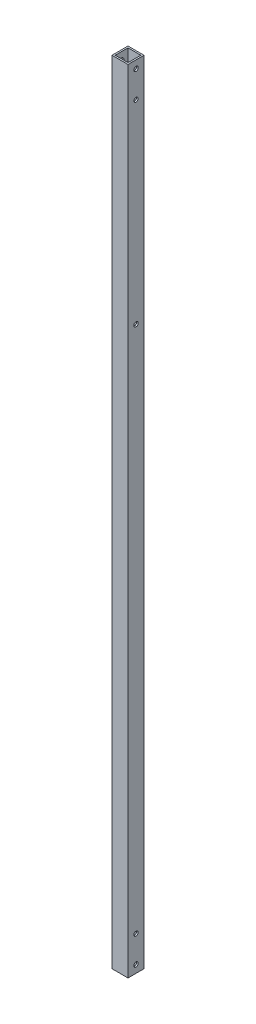
ISO-10303-21;
HEADER;
FILE_DESCRIPTION(('STEP AP214'),'2;1');
FILE_NAME('part.step','',(''),(''),'','','');
FILE_SCHEMA(('AUTOMOTIVE_DESIGN { 1 0 10303 214 1 1 1 1 }'));
ENDSEC;
DATA;
#1=APPLICATION_CONTEXT('core data for automotive mechanical design processes');
#2=APPLICATION_PROTOCOL_DEFINITION('international standard','automotive_design',2000,#1);
#3=PRODUCT_CONTEXT('',#1,'mechanical');
#4=PRODUCT('Part','Part','',(#3));
#5=PRODUCT_RELATED_PRODUCT_CATEGORY('part','',(#4));
#6=PRODUCT_DEFINITION_FORMATION('','',#4);
#7=PRODUCT_DEFINITION_CONTEXT('part definition',#1,'design');
#8=PRODUCT_DEFINITION('design','',#6,#7);
#9=PRODUCT_DEFINITION_SHAPE('','',#8);
#10=(LENGTH_UNIT() NAMED_UNIT(*) SI_UNIT(.MILLI.,.METRE.));
#11=(NAMED_UNIT(*) PLANE_ANGLE_UNIT() SI_UNIT($,.RADIAN.));
#12=(NAMED_UNIT(*) SI_UNIT($,.STERADIAN.) SOLID_ANGLE_UNIT());
#13=UNCERTAINTY_MEASURE_WITH_UNIT(LENGTH_MEASURE(1.E-05),#10,'distance_accuracy_value','');
#14=(GEOMETRIC_REPRESENTATION_CONTEXT(3) GLOBAL_UNCERTAINTY_ASSIGNED_CONTEXT((#13)) GLOBAL_UNIT_ASSIGNED_CONTEXT((#10,
#11,#12)) REPRESENTATION_CONTEXT('',''));
#15=CARTESIAN_POINT('',(0.,0.,0.));
#16=DIRECTION('',(0.,0.,1.));
#17=DIRECTION('',(1.,0.,0.));
#18=AXIS2_PLACEMENT_3D('',#15,#16,#17);
#19=CARTESIAN_POINT('',(0.,741.,0.));
#20=DIRECTION('',(0.,1.,0.));
#21=DIRECTION('',(0.,0.,1.));
#22=AXIS2_PLACEMENT_3D('',#19,#20,#21);
#23=PLANE('',#22);
#24=DIRECTION('',(0.,0.,-1.));
#25=VECTOR('',#24,1.);
#26=CARTESIAN_POINT('',(7.5,741.,7.5));
#27=LINE('',#26,#25);
#28=CARTESIAN_POINT('',(7.5,741.,7.5));
#29=VERTEX_POINT('',#28);
#30=CARTESIAN_POINT('',(7.5,741.,-7.5));
#31=VERTEX_POINT('',#30);
#32=EDGE_CURVE('E162',#29,#31,#27,.T.);
#33=ORIENTED_EDGE('',*,*,#32,.T.);
#34=DIRECTION('',(-1.,0.,0.));
#35=VECTOR('',#34,1.);
#36=CARTESIAN_POINT('',(-7.5,741.,-7.5));
#37=LINE('',#36,#35);
#38=CARTESIAN_POINT('',(-7.5,741.,-7.5));
#39=VERTEX_POINT('',#38);
#40=EDGE_CURVE('E165',#31,#39,#37,.T.);
#41=ORIENTED_EDGE('',*,*,#40,.T.);
#42=DIRECTION('',(0.,0.,1.));
#43=VECTOR('',#42,1.);
#44=CARTESIAN_POINT('',(-7.5,741.,7.5));
#45=LINE('',#44,#43);
#46=CARTESIAN_POINT('',(-7.5,741.,7.5));
#47=VERTEX_POINT('',#46);
#48=EDGE_CURVE('E168',#39,#47,#45,.T.);
#49=ORIENTED_EDGE('',*,*,#48,.T.);
#50=DIRECTION('',(1.,0.,0.));
#51=VECTOR('',#50,1.);
#52=CARTESIAN_POINT('',(-7.5,741.,7.5));
#53=LINE('',#52,#51);
#54=EDGE_CURVE('E170',#47,#29,#53,.T.);
#55=ORIENTED_EDGE('',*,*,#54,.T.);
#56=EDGE_LOOP('',(#33,#41,#49,#55));
#57=FACE_BOUND('',#56,.T.);
#58=DIRECTION('',(-1.,0.,0.));
#59=VECTOR('',#58,1.);
#60=CARTESIAN_POINT('',(0.,741.,-6.));
#61=LINE('',#60,#59);
#62=CARTESIAN_POINT('',(6.,741.,-6.));
#63=VERTEX_POINT('',#62);
#64=CARTESIAN_POINT('',(-6.,741.,-6.));
#65=VERTEX_POINT('',#64);
#66=EDGE_CURVE('E132',#63,#65,#61,.T.);
#67=ORIENTED_EDGE('',*,*,#66,.F.);
#68=DIRECTION('',(0.,0.,-1.));
#69=VECTOR('',#68,1.);
#70=CARTESIAN_POINT('',(6.,741.,0.));
#71=LINE('',#70,#69);
#72=CARTESIAN_POINT('',(6.,741.,6.));
#73=VERTEX_POINT('',#72);
#74=EDGE_CURVE('E124',#73,#63,#71,.T.);
#75=ORIENTED_EDGE('',*,*,#74,.F.);
#76=DIRECTION('',(1.,0.,0.));
#77=VECTOR('',#76,1.);
#78=CARTESIAN_POINT('',(0.,741.,6.));
#79=LINE('',#78,#77);
#80=CARTESIAN_POINT('',(-6.,741.,6.));
#81=VERTEX_POINT('',#80);
#82=EDGE_CURVE('E146',#81,#73,#79,.T.);
#83=ORIENTED_EDGE('',*,*,#82,.F.);
#84=DIRECTION('',(0.,0.,1.));
#85=VECTOR('',#84,1.);
#86=CARTESIAN_POINT('',(-6.,741.,0.));
#87=LINE('',#86,#85);
#88=EDGE_CURVE('E144',#65,#81,#87,.T.);
#89=ORIENTED_EDGE('',*,*,#88,.F.);
#90=EDGE_LOOP('',(#67,#75,#83,#89));
#91=FACE_BOUND('',#90,.T.);
#92=ADVANCED_FACE('F57',(#57,#91),#23,.T.);
#93=CARTESIAN_POINT('',(0.,0.,0.));
#94=DIRECTION('',(0.,1.,0.));
#95=DIRECTION('',(0.,0.,1.));
#96=AXIS2_PLACEMENT_3D('',#93,#94,#95);
#97=PLANE('',#96);
#98=DIRECTION('',(0.,0.,-1.));
#99=VECTOR('',#98,1.);
#100=CARTESIAN_POINT('',(7.5,0.,7.5));
#101=LINE('',#100,#99);
#102=CARTESIAN_POINT('',(7.5,0.,7.5));
#103=VERTEX_POINT('',#102);
#104=CARTESIAN_POINT('',(7.5,0.,-7.5));
#105=VERTEX_POINT('',#104);
#106=EDGE_CURVE('E140',#103,#105,#101,.T.);
#107=ORIENTED_EDGE('',*,*,#106,.F.);
#108=DIRECTION('',(1.,0.,0.));
#109=VECTOR('',#108,1.);
#110=CARTESIAN_POINT('',(-7.5,0.,7.5));
#111=LINE('',#110,#109);
#112=CARTESIAN_POINT('',(-7.5,0.,7.5));
#113=VERTEX_POINT('',#112);
#114=EDGE_CURVE('E166',#113,#103,#111,.T.);
#115=ORIENTED_EDGE('',*,*,#114,.F.);
#116=DIRECTION('',(0.,0.,1.));
#117=VECTOR('',#116,1.);
#118=CARTESIAN_POINT('',(-7.5,0.,7.5));
#119=LINE('',#118,#117);
#120=CARTESIAN_POINT('',(-7.5,0.,-7.5));
#121=VERTEX_POINT('',#120);
#122=EDGE_CURVE('E177',#121,#113,#119,.T.);
#123=ORIENTED_EDGE('',*,*,#122,.F.);
#124=DIRECTION('',(-1.,0.,0.));
#125=VECTOR('',#124,1.);
#126=CARTESIAN_POINT('',(-7.5,0.,-7.5));
#127=LINE('',#126,#125);
#128=EDGE_CURVE('E175',#105,#121,#127,.T.);
#129=ORIENTED_EDGE('',*,*,#128,.F.);
#130=EDGE_LOOP('',(#107,#115,#123,#129));
#131=FACE_BOUND('',#130,.T.);
#132=DIRECTION('',(0.,0.,-1.));
#133=VECTOR('',#132,1.);
#134=CARTESIAN_POINT('',(6.,0.,0.));
#135=LINE('',#134,#133);
#136=CARTESIAN_POINT('',(6.,0.,6.));
#137=VERTEX_POINT('',#136);
#138=CARTESIAN_POINT('',(6.,0.,-6.));
#139=VERTEX_POINT('',#138);
#140=EDGE_CURVE('E82',#137,#139,#135,.T.);
#141=ORIENTED_EDGE('',*,*,#140,.T.);
#142=DIRECTION('',(-1.,0.,0.));
#143=VECTOR('',#142,1.);
#144=CARTESIAN_POINT('',(0.,0.,-6.));
#145=LINE('',#144,#143);
#146=CARTESIAN_POINT('',(-6.,0.,-6.));
#147=VERTEX_POINT('',#146);
#148=EDGE_CURVE('E139',#139,#147,#145,.T.);
#149=ORIENTED_EDGE('',*,*,#148,.T.);
#150=DIRECTION('',(0.,0.,1.));
#151=VECTOR('',#150,1.);
#152=CARTESIAN_POINT('',(-6.,0.,0.));
#153=LINE('',#152,#151);
#154=CARTESIAN_POINT('',(-6.,0.,6.));
#155=VERTEX_POINT('',#154);
#156=EDGE_CURVE('E154',#147,#155,#153,.T.);
#157=ORIENTED_EDGE('',*,*,#156,.T.);
#158=DIRECTION('',(1.,0.,0.));
#159=VECTOR('',#158,1.);
#160=CARTESIAN_POINT('',(0.,0.,6.));
#161=LINE('',#160,#159);
#162=EDGE_CURVE('E133',#155,#137,#161,.T.);
#163=ORIENTED_EDGE('',*,*,#162,.T.);
#164=EDGE_LOOP('',(#141,#149,#157,#163));
#165=FACE_BOUND('',#164,.T.);
#166=ADVANCED_FACE('F235',(#131,#165),#97,.F.);
#167=CARTESIAN_POINT('',(7.5,741.,7.5));
#168=DIRECTION('',(-1.,0.,0.));
#169=DIRECTION('',(0.,0.,1.));
#170=AXIS2_PLACEMENT_3D('',#167,#168,#169);
#171=PLANE('',#170);
#172=CARTESIAN_POINT('',(7.5,7.29000000000002,0.));
#173=DIRECTION('',(1.,0.,0.));
#174=DIRECTION('',(0.,0.,-1.));
#175=AXIS2_PLACEMENT_3D('',#172,#173,#174);
#176=CIRCLE('',#175,2.1);
#177=CARTESIAN_POINT('',(7.5,7.29000000000002,-2.1));
#178=VERTEX_POINT('',#177);
#179=EDGE_CURVE('E288',#178,#178,#176,.T.);
#180=ORIENTED_EDGE('',*,*,#179,.F.);
#181=EDGE_LOOP('',(#180));
#182=FACE_BOUND('',#181,.T.);
#183=CARTESIAN_POINT('',(7.5,32.29,0.));
#184=DIRECTION('',(1.,0.,0.));
#185=DIRECTION('',(0.,0.,-1.));
#186=AXIS2_PLACEMENT_3D('',#183,#184,#185);
#187=CIRCLE('',#186,2.);
#188=CARTESIAN_POINT('',(7.5,32.29,-2.));
#189=VERTEX_POINT('',#188);
#190=EDGE_CURVE('E292',#189,#189,#187,.T.);
#191=ORIENTED_EDGE('',*,*,#190,.F.);
#192=EDGE_LOOP('',(#191));
#193=FACE_BOUND('',#192,.T.);
#194=CARTESIAN_POINT('',(7.5,526.49,0.));
#195=DIRECTION('',(1.,0.,0.));
#196=DIRECTION('',(0.,0.,-1.));
#197=AXIS2_PLACEMENT_3D('',#194,#195,#196);
#198=CIRCLE('',#197,2.10000000000007);
#199=CARTESIAN_POINT('',(7.5,526.49,-2.1));
#200=VERTEX_POINT('',#199);
#201=EDGE_CURVE('E296',#200,#200,#198,.T.);
#202=ORIENTED_EDGE('',*,*,#201,.F.);
#203=EDGE_LOOP('',(#202));
#204=FACE_BOUND('',#203,.T.);
#205=CARTESIAN_POINT('',(7.5,708.71,0.));
#206=DIRECTION('',(1.,0.,0.));
#207=DIRECTION('',(0.,0.,1.));
#208=AXIS2_PLACEMENT_3D('',#205,#206,#207);
#209=CIRCLE('',#208,2.);
#210=CARTESIAN_POINT('',(7.5,708.71,2.00000000000001));
#211=VERTEX_POINT('',#210);
#212=EDGE_CURVE('E300',#211,#211,#209,.T.);
#213=ORIENTED_EDGE('',*,*,#212,.F.);
#214=EDGE_LOOP('',(#213));
#215=FACE_BOUND('',#214,.T.);
#216=CARTESIAN_POINT('',(7.5,733.71,0.));
#217=DIRECTION('',(1.,0.,0.));
#218=DIRECTION('',(0.,0.,1.));
#219=AXIS2_PLACEMENT_3D('',#216,#217,#218);
#220=CIRCLE('',#219,2.10000000000004);
#221=CARTESIAN_POINT('',(7.5,733.71,2.10000000000005));
#222=VERTEX_POINT('',#221);
#223=EDGE_CURVE('E303',#222,#222,#220,.T.);
#224=ORIENTED_EDGE('',*,*,#223,.F.);
#225=EDGE_LOOP('',(#224));
#226=FACE_BOUND('',#225,.T.);
#227=ORIENTED_EDGE('',*,*,#106,.T.);
#228=DIRECTION('',(0.,-1.,0.));
#229=VECTOR('',#228,1.);
#230=CARTESIAN_POINT('',(7.5,741.,-7.5));
#231=LINE('',#230,#229);
#232=EDGE_CURVE('E12',#31,#105,#231,.T.);
#233=ORIENTED_EDGE('',*,*,#232,.F.);
#234=ORIENTED_EDGE('',*,*,#32,.F.);
#235=DIRECTION('',(0.,-1.,0.));
#236=VECTOR('',#235,1.);
#237=CARTESIAN_POINT('',(7.5,741.,7.5));
#238=LINE('',#237,#236);
#239=EDGE_CURVE('E172',#29,#103,#238,.T.);
#240=ORIENTED_EDGE('',*,*,#239,.T.);
#241=EDGE_LOOP('',(#227,#233,#234,#240));
#242=FACE_BOUND('',#241,.T.);
#243=ADVANCED_FACE('F59',(#182,#193,#204,#215,#226,#242),#171,.F.);
#244=CARTESIAN_POINT('',(-7.5,741.,-7.5));
#245=DIRECTION('',(0.,0.,1.));
#246=DIRECTION('',(1.,0.,0.));
#247=AXIS2_PLACEMENT_3D('',#244,#245,#246);
#248=PLANE('',#247);
#249=ORIENTED_EDGE('',*,*,#128,.T.);
#250=DIRECTION('',(0.,-1.,0.));
#251=VECTOR('',#250,1.);
#252=CARTESIAN_POINT('',(-7.5,741.,-7.5));
#253=LINE('',#252,#251);
#254=EDGE_CURVE('E66',#39,#121,#253,.T.);
#255=ORIENTED_EDGE('',*,*,#254,.F.);
#256=ORIENTED_EDGE('',*,*,#40,.F.);
#257=ORIENTED_EDGE('',*,*,#232,.T.);
#258=EDGE_LOOP('',(#249,#255,#256,#257));
#259=FACE_BOUND('',#258,.T.);
#260=ADVANCED_FACE('F263',(#259),#248,.F.);
#261=CARTESIAN_POINT('',(-7.5,741.,7.5));
#262=DIRECTION('',(1.,0.,0.));
#263=DIRECTION('',(0.,0.,-1.));
#264=AXIS2_PLACEMENT_3D('',#261,#262,#263);
#265=PLANE('',#264);
#266=CARTESIAN_POINT('',(-7.5,7.29000000000002,0.));
#267=DIRECTION('',(1.,0.,0.));
#268=DIRECTION('',(0.,0.,-1.));
#269=AXIS2_PLACEMENT_3D('',#266,#267,#268);
#270=CIRCLE('',#269,2.1);
#271=CARTESIAN_POINT('',(-7.5,7.29000000000002,-2.1));
#272=VERTEX_POINT('',#271);
#273=EDGE_CURVE('E191',#272,#272,#270,.T.);
#274=ORIENTED_EDGE('',*,*,#273,.T.);
#275=EDGE_LOOP('',(#274));
#276=FACE_BOUND('',#275,.T.);
#277=CARTESIAN_POINT('',(-7.5,32.29,0.));
#278=DIRECTION('',(1.,0.,0.));
#279=DIRECTION('',(0.,0.,-1.));
#280=AXIS2_PLACEMENT_3D('',#277,#278,#279);
#281=CIRCLE('',#280,2.);
#282=CARTESIAN_POINT('',(-7.5,32.29,-2.));
#283=VERTEX_POINT('',#282);
#284=EDGE_CURVE('E340',#283,#283,#281,.T.);
#285=ORIENTED_EDGE('',*,*,#284,.T.);
#286=EDGE_LOOP('',(#285));
#287=FACE_BOUND('',#286,.T.);
#288=CARTESIAN_POINT('',(-7.5,526.49,0.));
#289=DIRECTION('',(1.,0.,0.));
#290=DIRECTION('',(0.,0.,-1.));
#291=AXIS2_PLACEMENT_3D('',#288,#289,#290);
#292=CIRCLE('',#291,2.10000000000007);
#293=CARTESIAN_POINT('',(-7.5,526.49,-2.1));
#294=VERTEX_POINT('',#293);
#295=EDGE_CURVE('E336',#294,#294,#292,.T.);
#296=ORIENTED_EDGE('',*,*,#295,.T.);
#297=EDGE_LOOP('',(#296));
#298=FACE_BOUND('',#297,.T.);
#299=CARTESIAN_POINT('',(-7.5,708.71,0.));
#300=DIRECTION('',(1.,0.,0.));
#301=DIRECTION('',(0.,0.,1.));
#302=AXIS2_PLACEMENT_3D('',#299,#300,#301);
#303=CIRCLE('',#302,2.);
#304=CARTESIAN_POINT('',(-7.5,708.71,2.00000000000001));
#305=VERTEX_POINT('',#304);
#306=EDGE_CURVE('E331',#305,#305,#303,.T.);
#307=ORIENTED_EDGE('',*,*,#306,.T.);
#308=EDGE_LOOP('',(#307));
#309=FACE_BOUND('',#308,.T.);
#310=CARTESIAN_POINT('',(-7.5,733.71,0.));
#311=DIRECTION('',(1.,0.,0.));
#312=DIRECTION('',(0.,0.,1.));
#313=AXIS2_PLACEMENT_3D('',#310,#311,#312);
#314=CIRCLE('',#313,2.10000000000004);
#315=CARTESIAN_POINT('',(-7.5,733.71,2.10000000000005));
#316=VERTEX_POINT('',#315);
#317=EDGE_CURVE('E305',#316,#316,#314,.T.);
#318=ORIENTED_EDGE('',*,*,#317,.T.);
#319=EDGE_LOOP('',(#318));
#320=FACE_BOUND('',#319,.T.);
#321=ORIENTED_EDGE('',*,*,#122,.T.);
#322=DIRECTION('',(0.,-1.,0.));
#323=VECTOR('',#322,1.);
#324=CARTESIAN_POINT('',(-7.5,741.,7.5));
#325=LINE('',#324,#323);
#326=EDGE_CURVE('E182',#47,#113,#325,.T.);
#327=ORIENTED_EDGE('',*,*,#326,.F.);
#328=ORIENTED_EDGE('',*,*,#48,.F.);
#329=ORIENTED_EDGE('',*,*,#254,.T.);
#330=EDGE_LOOP('',(#321,#327,#328,#329));
#331=FACE_BOUND('',#330,.T.);
#332=ADVANCED_FACE('F260',(#276,#287,#298,#309,#320,#331),#265,.F.);
#333=CARTESIAN_POINT('',(-7.5,741.,7.5));
#334=DIRECTION('',(0.,0.,-1.));
#335=DIRECTION('',(-1.,0.,0.));
#336=AXIS2_PLACEMENT_3D('',#333,#334,#335);
#337=PLANE('',#336);
#338=ORIENTED_EDGE('',*,*,#114,.T.);
#339=ORIENTED_EDGE('',*,*,#239,.F.);
#340=ORIENTED_EDGE('',*,*,#54,.F.);
#341=ORIENTED_EDGE('',*,*,#326,.T.);
#342=EDGE_LOOP('',(#338,#339,#340,#341));
#343=FACE_BOUND('',#342,.T.);
#344=ADVANCED_FACE('F257',(#343),#337,.F.);
#345=CARTESIAN_POINT('',(6.,741.,0.));
#346=DIRECTION('',(-1.,0.,0.));
#347=DIRECTION('',(0.,0.,1.));
#348=AXIS2_PLACEMENT_3D('',#345,#346,#347);
#349=PLANE('',#348);
#350=CARTESIAN_POINT('',(6.,7.29000000000002,0.));
#351=DIRECTION('',(-1.,0.,0.));
#352=DIRECTION('',(0.,0.,1.));
#353=AXIS2_PLACEMENT_3D('',#350,#351,#352);
#354=CIRCLE('',#353,2.1);
#355=CARTESIAN_POINT('',(6.,7.29000000000002,2.1));
#356=VERTEX_POINT('',#355);
#357=EDGE_CURVE('E152',#356,#356,#354,.T.);
#358=ORIENTED_EDGE('',*,*,#357,.F.);
#359=EDGE_LOOP('',(#358));
#360=FACE_BOUND('',#359,.T.);
#361=CARTESIAN_POINT('',(6.,32.29,0.));
#362=DIRECTION('',(-1.,0.,0.));
#363=DIRECTION('',(0.,0.,1.));
#364=AXIS2_PLACEMENT_3D('',#361,#362,#363);
#365=CIRCLE('',#364,2.);
#366=CARTESIAN_POINT('',(6.,32.29,2.00000000000001));
#367=VERTEX_POINT('',#366);
#368=EDGE_CURVE('E201',#367,#367,#365,.T.);
#369=ORIENTED_EDGE('',*,*,#368,.F.);
#370=EDGE_LOOP('',(#369));
#371=FACE_BOUND('',#370,.T.);
#372=CARTESIAN_POINT('',(6.,526.49,0.));
#373=DIRECTION('',(-1.,0.,0.));
#374=DIRECTION('',(0.,0.,1.));
#375=AXIS2_PLACEMENT_3D('',#372,#373,#374);
#376=CIRCLE('',#375,2.10000000000007);
#377=CARTESIAN_POINT('',(6.,526.49,2.10000000000013));
#378=VERTEX_POINT('',#377);
#379=EDGE_CURVE('E198',#378,#378,#376,.T.);
#380=ORIENTED_EDGE('',*,*,#379,.F.);
#381=EDGE_LOOP('',(#380));
#382=FACE_BOUND('',#381,.T.);
#383=CARTESIAN_POINT('',(6.,708.71,0.));
#384=DIRECTION('',(-1.,0.,0.));
#385=DIRECTION('',(0.,0.,1.));
#386=AXIS2_PLACEMENT_3D('',#383,#384,#385);
#387=CIRCLE('',#386,2.);
#388=CARTESIAN_POINT('',(6.,708.71,2.00000000000001));
#389=VERTEX_POINT('',#388);
#390=EDGE_CURVE('E195',#389,#389,#387,.T.);
#391=ORIENTED_EDGE('',*,*,#390,.F.);
#392=EDGE_LOOP('',(#391));
#393=FACE_BOUND('',#392,.T.);
#394=CARTESIAN_POINT('',(6.,733.71,0.));
#395=DIRECTION('',(-1.,0.,0.));
#396=DIRECTION('',(0.,0.,1.));
#397=AXIS2_PLACEMENT_3D('',#394,#395,#396);
#398=CIRCLE('',#397,2.10000000000004);
#399=CARTESIAN_POINT('',(6.,733.71,2.10000000000005));
#400=VERTEX_POINT('',#399);
#401=EDGE_CURVE('E190',#400,#400,#398,.T.);
#402=ORIENTED_EDGE('',*,*,#401,.F.);
#403=EDGE_LOOP('',(#402));
#404=FACE_BOUND('',#403,.T.);
#405=ORIENTED_EDGE('',*,*,#140,.F.);
#406=DIRECTION('',(0.,-1.,0.));
#407=VECTOR('',#406,1.);
#408=CARTESIAN_POINT('',(6.,741.,6.));
#409=LINE('',#408,#407);
#410=EDGE_CURVE('E128',#73,#137,#409,.T.);
#411=ORIENTED_EDGE('',*,*,#410,.F.);
#412=ORIENTED_EDGE('',*,*,#74,.T.);
#413=DIRECTION('',(0.,-1.,0.));
#414=VECTOR('',#413,1.);
#415=CARTESIAN_POINT('',(6.,741.,-6.));
#416=LINE('',#415,#414);
#417=EDGE_CURVE('E127',#63,#139,#416,.T.);
#418=ORIENTED_EDGE('',*,*,#417,.T.);
#419=EDGE_LOOP('',(#405,#411,#412,#418));
#420=FACE_BOUND('',#419,.T.);
#421=ADVANCED_FACE('F126',(#360,#371,#382,#393,#404,#420),#349,.T.);
#422=CARTESIAN_POINT('',(0.,741.,-6.));
#423=DIRECTION('',(0.,0.,1.));
#424=DIRECTION('',(1.,0.,0.));
#425=AXIS2_PLACEMENT_3D('',#422,#423,#424);
#426=PLANE('',#425);
#427=ORIENTED_EDGE('',*,*,#148,.F.);
#428=ORIENTED_EDGE('',*,*,#417,.F.);
#429=ORIENTED_EDGE('',*,*,#66,.T.);
#430=DIRECTION('',(0.,-1.,0.));
#431=VECTOR('',#430,1.);
#432=CARTESIAN_POINT('',(-6.,741.,-6.));
#433=LINE('',#432,#431);
#434=EDGE_CURVE('E141',#65,#147,#433,.T.);
#435=ORIENTED_EDGE('',*,*,#434,.T.);
#436=EDGE_LOOP('',(#427,#428,#429,#435));
#437=FACE_BOUND('',#436,.T.);
#438=ADVANCED_FACE('F136',(#437),#426,.T.);
#439=CARTESIAN_POINT('',(-6.,741.,0.));
#440=DIRECTION('',(1.,0.,0.));
#441=DIRECTION('',(0.,0.,-1.));
#442=AXIS2_PLACEMENT_3D('',#439,#440,#441);
#443=PLANE('',#442);
#444=CARTESIAN_POINT('',(-6.,7.29000000000002,0.));
#445=DIRECTION('',(1.,0.,0.));
#446=DIRECTION('',(0.,0.,-1.));
#447=AXIS2_PLACEMENT_3D('',#444,#445,#446);
#448=CIRCLE('',#447,2.1);
#449=CARTESIAN_POINT('',(-6.,7.29000000000002,-2.1));
#450=VERTEX_POINT('',#449);
#451=EDGE_CURVE('E61',#450,#450,#448,.T.);
#452=ORIENTED_EDGE('',*,*,#451,.F.);
#453=EDGE_LOOP('',(#452));
#454=FACE_BOUND('',#453,.T.);
#455=CARTESIAN_POINT('',(-6.,32.29,0.));
#456=DIRECTION('',(1.,0.,0.));
#457=DIRECTION('',(0.,0.,-1.));
#458=AXIS2_PLACEMENT_3D('',#455,#456,#457);
#459=CIRCLE('',#458,2.);
#460=CARTESIAN_POINT('',(-6.,32.29,-2.));
#461=VERTEX_POINT('',#460);
#462=EDGE_CURVE('E199',#461,#461,#459,.T.);
#463=ORIENTED_EDGE('',*,*,#462,.F.);
#464=EDGE_LOOP('',(#463));
#465=FACE_BOUND('',#464,.T.);
#466=CARTESIAN_POINT('',(-6.,526.49,0.));
#467=DIRECTION('',(1.,0.,0.));
#468=DIRECTION('',(0.,0.,-1.));
#469=AXIS2_PLACEMENT_3D('',#466,#467,#468);
#470=CIRCLE('',#469,2.10000000000007);
#471=CARTESIAN_POINT('',(-6.,526.49,-2.1));
#472=VERTEX_POINT('',#471);
#473=EDGE_CURVE('E196',#472,#472,#470,.T.);
#474=ORIENTED_EDGE('',*,*,#473,.F.);
#475=EDGE_LOOP('',(#474));
#476=FACE_BOUND('',#475,.T.);
#477=CARTESIAN_POINT('',(-6.,708.71,0.));
#478=DIRECTION('',(1.,0.,0.));
#479=DIRECTION('',(0.,0.,-1.));
#480=AXIS2_PLACEMENT_3D('',#477,#478,#479);
#481=CIRCLE('',#480,2.);
#482=CARTESIAN_POINT('',(-6.,708.71,-2.));
#483=VERTEX_POINT('',#482);
#484=EDGE_CURVE('E192',#483,#483,#481,.T.);
#485=ORIENTED_EDGE('',*,*,#484,.F.);
#486=EDGE_LOOP('',(#485));
#487=FACE_BOUND('',#486,.T.);
#488=CARTESIAN_POINT('',(-6.,733.71,0.));
#489=DIRECTION('',(1.,0.,0.));
#490=DIRECTION('',(0.,0.,-1.));
#491=AXIS2_PLACEMENT_3D('',#488,#489,#490);
#492=CIRCLE('',#491,2.10000000000004);
#493=CARTESIAN_POINT('',(-6.,733.71,-2.10000000000004));
#494=VERTEX_POINT('',#493);
#495=EDGE_CURVE('E187',#494,#494,#492,.T.);
#496=ORIENTED_EDGE('',*,*,#495,.F.);
#497=EDGE_LOOP('',(#496));
#498=FACE_BOUND('',#497,.T.);
#499=ORIENTED_EDGE('',*,*,#156,.F.);
#500=ORIENTED_EDGE('',*,*,#434,.F.);
#501=ORIENTED_EDGE('',*,*,#88,.T.);
#502=DIRECTION('',(0.,-1.,0.));
#503=VECTOR('',#502,1.);
#504=CARTESIAN_POINT('',(-6.,741.,6.));
#505=LINE('',#504,#503);
#506=EDGE_CURVE('E74',#81,#155,#505,.T.);
#507=ORIENTED_EDGE('',*,*,#506,.T.);
#508=EDGE_LOOP('',(#499,#500,#501,#507));
#509=FACE_BOUND('',#508,.T.);
#510=ADVANCED_FACE('F221',(#454,#465,#476,#487,#498,#509),#443,.T.);
#511=CARTESIAN_POINT('',(0.,741.,6.));
#512=DIRECTION('',(0.,0.,-1.));
#513=DIRECTION('',(-1.,0.,0.));
#514=AXIS2_PLACEMENT_3D('',#511,#512,#513);
#515=PLANE('',#514);
#516=ORIENTED_EDGE('',*,*,#162,.F.);
#517=ORIENTED_EDGE('',*,*,#506,.F.);
#518=ORIENTED_EDGE('',*,*,#82,.T.);
#519=ORIENTED_EDGE('',*,*,#410,.T.);
#520=EDGE_LOOP('',(#516,#517,#518,#519));
#521=FACE_BOUND('',#520,.T.);
#522=ADVANCED_FACE('F224',(#521),#515,.T.);
#523=CARTESIAN_POINT('',(-7.5,733.71,0.));
#524=DIRECTION('',(1.,0.,0.));
#525=DIRECTION('',(0.,0.,-1.));
#526=AXIS2_PLACEMENT_3D('',#523,#524,#525);
#527=CYLINDRICAL_SURFACE('',#526,2.10000000000004);
#528=ORIENTED_EDGE('',*,*,#495,.T.);
#529=EDGE_LOOP('',(#528));
#530=FACE_BOUND('',#529,.T.);
#531=ORIENTED_EDGE('',*,*,#317,.F.);
#532=EDGE_LOOP('',(#531));
#533=FACE_BOUND('',#532,.T.);
#534=ADVANCED_FACE('F237',(#530,#533),#527,.F.);
#535=CARTESIAN_POINT('',(-7.5,708.71,0.));
#536=DIRECTION('',(1.,0.,0.));
#537=DIRECTION('',(0.,0.,-1.));
#538=AXIS2_PLACEMENT_3D('',#535,#536,#537);
#539=CYLINDRICAL_SURFACE('',#538,2.);
#540=ORIENTED_EDGE('',*,*,#484,.T.);
#541=EDGE_LOOP('',(#540));
#542=FACE_BOUND('',#541,.T.);
#543=ORIENTED_EDGE('',*,*,#306,.F.);
#544=EDGE_LOOP('',(#543));
#545=FACE_BOUND('',#544,.T.);
#546=ADVANCED_FACE('F242',(#542,#545),#539,.F.);
#547=CARTESIAN_POINT('',(-7.5,526.49,0.));
#548=DIRECTION('',(1.,0.,0.));
#549=DIRECTION('',(0.,0.,-1.));
#550=AXIS2_PLACEMENT_3D('',#547,#548,#549);
#551=CYLINDRICAL_SURFACE('',#550,2.10000000000007);
#552=ORIENTED_EDGE('',*,*,#473,.T.);
#553=EDGE_LOOP('',(#552));
#554=FACE_BOUND('',#553,.T.);
#555=ORIENTED_EDGE('',*,*,#295,.F.);
#556=EDGE_LOOP('',(#555));
#557=FACE_BOUND('',#556,.T.);
#558=ADVANCED_FACE('F355',(#554,#557),#551,.F.);
#559=CARTESIAN_POINT('',(-7.5,32.29,0.));
#560=DIRECTION('',(1.,0.,0.));
#561=DIRECTION('',(0.,0.,-1.));
#562=AXIS2_PLACEMENT_3D('',#559,#560,#561);
#563=CYLINDRICAL_SURFACE('',#562,2.);
#564=ORIENTED_EDGE('',*,*,#462,.T.);
#565=EDGE_LOOP('',(#564));
#566=FACE_BOUND('',#565,.T.);
#567=ORIENTED_EDGE('',*,*,#284,.F.);
#568=EDGE_LOOP('',(#567));
#569=FACE_BOUND('',#568,.T.);
#570=ADVANCED_FACE('F348',(#566,#569),#563,.F.);
#571=CARTESIAN_POINT('',(-7.5,7.29000000000002,0.));
#572=DIRECTION('',(1.,0.,0.));
#573=DIRECTION('',(0.,0.,-1.));
#574=AXIS2_PLACEMENT_3D('',#571,#572,#573);
#575=CYLINDRICAL_SURFACE('',#574,2.1);
#576=ORIENTED_EDGE('',*,*,#451,.T.);
#577=EDGE_LOOP('',(#576));
#578=FACE_BOUND('',#577,.T.);
#579=ORIENTED_EDGE('',*,*,#273,.F.);
#580=EDGE_LOOP('',(#579));
#581=FACE_BOUND('',#580,.T.);
#582=ADVANCED_FACE('F218',(#578,#581),#575,.F.);
#583=ORIENTED_EDGE('',*,*,#401,.T.);
#584=EDGE_LOOP('',(#583));
#585=FACE_BOUND('',#584,.T.);
#586=ORIENTED_EDGE('',*,*,#223,.T.);
#587=EDGE_LOOP('',(#586));
#588=FACE_BOUND('',#587,.T.);
#589=ADVANCED_FACE('F245',(#585,#588),#527,.F.);
#590=ORIENTED_EDGE('',*,*,#390,.T.);
#591=EDGE_LOOP('',(#590));
#592=FACE_BOUND('',#591,.T.);
#593=ORIENTED_EDGE('',*,*,#212,.T.);
#594=EDGE_LOOP('',(#593));
#595=FACE_BOUND('',#594,.T.);
#596=ADVANCED_FACE('F326',(#592,#595),#539,.F.);
#597=ORIENTED_EDGE('',*,*,#379,.T.);
#598=EDGE_LOOP('',(#597));
#599=FACE_BOUND('',#598,.T.);
#600=ORIENTED_EDGE('',*,*,#201,.T.);
#601=EDGE_LOOP('',(#600));
#602=FACE_BOUND('',#601,.T.);
#603=ADVANCED_FACE('F329',(#599,#602),#551,.F.);
#604=ORIENTED_EDGE('',*,*,#368,.T.);
#605=EDGE_LOOP('',(#604));
#606=FACE_BOUND('',#605,.T.);
#607=ORIENTED_EDGE('',*,*,#190,.T.);
#608=EDGE_LOOP('',(#607));
#609=FACE_BOUND('',#608,.T.);
#610=ADVANCED_FACE('F357',(#606,#609),#563,.F.);
#611=ORIENTED_EDGE('',*,*,#357,.T.);
#612=EDGE_LOOP('',(#611));
#613=FACE_BOUND('',#612,.T.);
#614=ORIENTED_EDGE('',*,*,#179,.T.);
#615=EDGE_LOOP('',(#614));
#616=FACE_BOUND('',#615,.T.);
#617=ADVANCED_FACE('F350',(#613,#616),#575,.F.);
#618=CLOSED_SHELL('',(#92,#166,#243,#260,#332,#344,#421,#438,#510,#522,#534,#546,#558,#570,#582,
#589,#596,#603,#610,#617));
#619=MANIFOLD_SOLID_BREP('B2',#618);
#620=ADVANCED_BREP_SHAPE_REPRESENTATION('',(#18,#619),#14);
#621=SHAPE_DEFINITION_REPRESENTATION(#9,#620);
ENDSEC;
END-ISO-10303-21;
